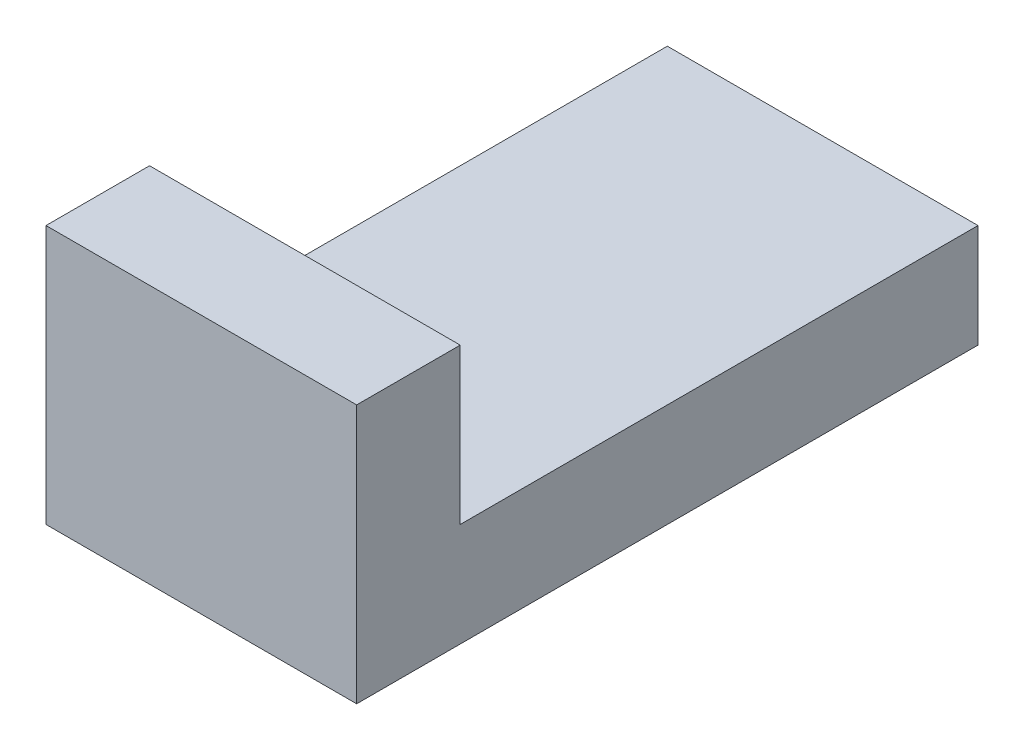
ISO-10303-21;
HEADER;
FILE_DESCRIPTION(('STEP AP214'),'2;1');
FILE_NAME('part.step','',(''),(''),'','','');
FILE_SCHEMA(('AUTOMOTIVE_DESIGN { 1 0 10303 214 1 1 1 1 }'));
ENDSEC;
DATA;
#1=APPLICATION_CONTEXT('core data for automotive mechanical design processes');
#2=APPLICATION_PROTOCOL_DEFINITION('international standard','automotive_design',2000,#1);
#3=PRODUCT_CONTEXT('',#1,'mechanical');
#4=PRODUCT('Part','Part','',(#3));
#5=PRODUCT_RELATED_PRODUCT_CATEGORY('part','',(#4));
#6=PRODUCT_DEFINITION_FORMATION('','',#4);
#7=PRODUCT_DEFINITION_CONTEXT('part definition',#1,'design');
#8=PRODUCT_DEFINITION('design','',#6,#7);
#9=PRODUCT_DEFINITION_SHAPE('','',#8);
#10=(LENGTH_UNIT() NAMED_UNIT(*) SI_UNIT(.MILLI.,.METRE.));
#11=(NAMED_UNIT(*) PLANE_ANGLE_UNIT() SI_UNIT($,.RADIAN.));
#12=(NAMED_UNIT(*) SI_UNIT($,.STERADIAN.) SOLID_ANGLE_UNIT());
#13=UNCERTAINTY_MEASURE_WITH_UNIT(LENGTH_MEASURE(1.E-05),#10,'distance_accuracy_value','');
#14=(GEOMETRIC_REPRESENTATION_CONTEXT(3) GLOBAL_UNCERTAINTY_ASSIGNED_CONTEXT((#13)) GLOBAL_UNIT_ASSIGNED_CONTEXT((#10,
#11,#12)) REPRESENTATION_CONTEXT('',''));
#15=CARTESIAN_POINT('',(0.,0.,0.));
#16=DIRECTION('',(0.,0.,1.));
#17=DIRECTION('',(1.,0.,0.));
#18=AXIS2_PLACEMENT_3D('',#15,#16,#17);
#19=CARTESIAN_POINT('',(15.,0.,0.));
#20=DIRECTION('',(0.,1.,0.));
#21=DIRECTION('',(0.,0.,1.));
#22=AXIS2_PLACEMENT_3D('',#19,#20,#21);
#23=PLANE('',#22);
#24=DIRECTION('',(0.,0.,-1.));
#25=VECTOR('',#24,1.);
#26=CARTESIAN_POINT('',(-15.,0.,0.));
#27=LINE('',#26,#25);
#28=CARTESIAN_POINT('',(-15.,0.,0.));
#29=VERTEX_POINT('',#28);
#30=CARTESIAN_POINT('',(-15.,0.,-60.));
#31=VERTEX_POINT('',#30);
#32=EDGE_CURVE('E120',#29,#31,#27,.T.);
#33=ORIENTED_EDGE('',*,*,#32,.T.);
#34=DIRECTION('',(-1.,0.,0.));
#35=VECTOR('',#34,1.);
#36=CARTESIAN_POINT('',(15.,0.,-60.));
#37=LINE('',#36,#35);
#38=CARTESIAN_POINT('',(15.,0.,-60.));
#39=VERTEX_POINT('',#38);
#40=EDGE_CURVE('E11',#39,#31,#37,.T.);
#41=ORIENTED_EDGE('',*,*,#40,.F.);
#42=DIRECTION('',(0.,0.,-1.));
#43=VECTOR('',#42,1.);
#44=CARTESIAN_POINT('',(15.,0.,0.));
#45=LINE('',#44,#43);
#46=CARTESIAN_POINT('',(15.,0.,0.));
#47=VERTEX_POINT('',#46);
#48=EDGE_CURVE('E82',#47,#39,#45,.T.);
#49=ORIENTED_EDGE('',*,*,#48,.F.);
#50=DIRECTION('',(-1.,0.,0.));
#51=VECTOR('',#50,1.);
#52=CARTESIAN_POINT('',(15.,0.,0.));
#53=LINE('',#52,#51);
#54=EDGE_CURVE('E116',#47,#29,#53,.T.);
#55=ORIENTED_EDGE('',*,*,#54,.T.);
#56=EDGE_LOOP('',(#33,#41,#49,#55));
#57=FACE_BOUND('',#56,.T.);
#58=ADVANCED_FACE('F39',(#57),#23,.F.);
#59=CARTESIAN_POINT('',(15.,10.,-60.));
#60=DIRECTION('',(0.,0.,-1.));
#61=DIRECTION('',(-1.,0.,0.));
#62=AXIS2_PLACEMENT_3D('',#59,#60,#61);
#63=PLANE('',#62);
#64=DIRECTION('',(0.,-1.,0.));
#65=VECTOR('',#64,1.);
#66=CARTESIAN_POINT('',(-15.,10.,-60.));
#67=LINE('',#66,#65);
#68=CARTESIAN_POINT('',(-15.,10.,-60.));
#69=VERTEX_POINT('',#68);
#70=EDGE_CURVE('E121',#69,#31,#67,.T.);
#71=ORIENTED_EDGE('',*,*,#70,.F.);
#72=DIRECTION('',(-1.,0.,0.));
#73=VECTOR('',#72,1.);
#74=CARTESIAN_POINT('',(15.,10.,-60.));
#75=LINE('',#74,#73);
#76=CARTESIAN_POINT('',(15.,10.,-60.));
#77=VERTEX_POINT('',#76);
#78=EDGE_CURVE('E50',#77,#69,#75,.T.);
#79=ORIENTED_EDGE('',*,*,#78,.F.);
#80=DIRECTION('',(0.,-1.,0.));
#81=VECTOR('',#80,1.);
#82=CARTESIAN_POINT('',(15.,10.,-60.));
#83=LINE('',#82,#81);
#84=EDGE_CURVE('E208',#77,#39,#83,.T.);
#85=ORIENTED_EDGE('',*,*,#84,.T.);
#86=ORIENTED_EDGE('',*,*,#40,.T.);
#87=EDGE_LOOP('',(#71,#79,#85,#86));
#88=FACE_BOUND('',#87,.T.);
#89=ADVANCED_FACE('F141',(#88),#63,.T.);
#90=CARTESIAN_POINT('',(15.,10.,0.));
#91=DIRECTION('',(0.,1.,0.));
#92=DIRECTION('',(0.,0.,1.));
#93=AXIS2_PLACEMENT_3D('',#90,#91,#92);
#94=PLANE('',#93);
#95=DIRECTION('',(0.,0.,-1.));
#96=VECTOR('',#95,1.);
#97=CARTESIAN_POINT('',(-15.,10.,0.));
#98=LINE('',#97,#96);
#99=CARTESIAN_POINT('',(-15.,10.,-10.));
#100=VERTEX_POINT('',#99);
#101=EDGE_CURVE('E128',#100,#69,#98,.T.);
#102=ORIENTED_EDGE('',*,*,#101,.F.);
#103=DIRECTION('',(-1.,0.,0.));
#104=VECTOR('',#103,1.);
#105=CARTESIAN_POINT('',(15.,10.,-10.));
#106=LINE('',#105,#104);
#107=CARTESIAN_POINT('',(15.,10.,-10.));
#108=VERTEX_POINT('',#107);
#109=EDGE_CURVE('E106',#108,#100,#106,.T.);
#110=ORIENTED_EDGE('',*,*,#109,.F.);
#111=DIRECTION('',(0.,0.,-1.));
#112=VECTOR('',#111,1.);
#113=CARTESIAN_POINT('',(15.,10.,0.));
#114=LINE('',#113,#112);
#115=EDGE_CURVE('E115',#108,#77,#114,.T.);
#116=ORIENTED_EDGE('',*,*,#115,.T.);
#117=ORIENTED_EDGE('',*,*,#78,.T.);
#118=EDGE_LOOP('',(#102,#110,#116,#117));
#119=FACE_BOUND('',#118,.T.);
#120=ADVANCED_FACE('F138',(#119),#94,.T.);
#121=CARTESIAN_POINT('',(15.,25.,-10.));
#122=DIRECTION('',(0.,0.,-1.));
#123=DIRECTION('',(0.,1.,0.));
#124=AXIS2_PLACEMENT_3D('',#121,#122,#123);
#125=PLANE('',#124);
#126=DIRECTION('',(0.,-1.,0.));
#127=VECTOR('',#126,1.);
#128=CARTESIAN_POINT('',(-15.,25.,-10.));
#129=LINE('',#128,#127);
#130=CARTESIAN_POINT('',(-15.,25.,-10.));
#131=VERTEX_POINT('',#130);
#132=EDGE_CURVE('E102',#131,#100,#129,.T.);
#133=ORIENTED_EDGE('',*,*,#132,.F.);
#134=DIRECTION('',(-1.,0.,0.));
#135=VECTOR('',#134,1.);
#136=CARTESIAN_POINT('',(15.,25.,-10.));
#137=LINE('',#136,#135);
#138=CARTESIAN_POINT('',(15.,25.,-10.));
#139=VERTEX_POINT('',#138);
#140=EDGE_CURVE('E96',#139,#131,#137,.T.);
#141=ORIENTED_EDGE('',*,*,#140,.F.);
#142=DIRECTION('',(0.,-1.,0.));
#143=VECTOR('',#142,1.);
#144=CARTESIAN_POINT('',(15.,25.,-10.));
#145=LINE('',#144,#143);
#146=EDGE_CURVE('E98',#139,#108,#145,.T.);
#147=ORIENTED_EDGE('',*,*,#146,.T.);
#148=ORIENTED_EDGE('',*,*,#109,.T.);
#149=EDGE_LOOP('',(#133,#141,#147,#148));
#150=FACE_BOUND('',#149,.T.);
#151=ADVANCED_FACE('F97',(#150),#125,.T.);
#152=CARTESIAN_POINT('',(15.,25.,0.));
#153=DIRECTION('',(0.,1.,0.));
#154=DIRECTION('',(0.,0.,1.));
#155=AXIS2_PLACEMENT_3D('',#152,#153,#154);
#156=PLANE('',#155);
#157=DIRECTION('',(0.,0.,-1.));
#158=VECTOR('',#157,1.);
#159=CARTESIAN_POINT('',(-15.,25.,0.));
#160=LINE('',#159,#158);
#161=CARTESIAN_POINT('',(-15.,25.,0.));
#162=VERTEX_POINT('',#161);
#163=EDGE_CURVE('E127',#162,#131,#160,.T.);
#164=ORIENTED_EDGE('',*,*,#163,.F.);
#165=DIRECTION('',(-1.,0.,0.));
#166=VECTOR('',#165,1.);
#167=CARTESIAN_POINT('',(15.,25.,0.));
#168=LINE('',#167,#166);
#169=CARTESIAN_POINT('',(15.,25.,0.));
#170=VERTEX_POINT('',#169);
#171=EDGE_CURVE('E78',#170,#162,#168,.T.);
#172=ORIENTED_EDGE('',*,*,#171,.F.);
#173=DIRECTION('',(0.,0.,-1.));
#174=VECTOR('',#173,1.);
#175=CARTESIAN_POINT('',(15.,25.,0.));
#176=LINE('',#175,#174);
#177=EDGE_CURVE('E110',#170,#139,#176,.T.);
#178=ORIENTED_EDGE('',*,*,#177,.T.);
#179=ORIENTED_EDGE('',*,*,#140,.T.);
#180=EDGE_LOOP('',(#164,#172,#178,#179));
#181=FACE_BOUND('',#180,.T.);
#182=ADVANCED_FACE('F114',(#181),#156,.T.);
#183=CARTESIAN_POINT('',(15.,25.,0.));
#184=DIRECTION('',(0.,0.,-1.));
#185=DIRECTION('',(0.,1.,0.));
#186=AXIS2_PLACEMENT_3D('',#183,#184,#185);
#187=PLANE('',#186);
#188=DIRECTION('',(0.,-1.,0.));
#189=VECTOR('',#188,1.);
#190=CARTESIAN_POINT('',(-15.,25.,0.));
#191=LINE('',#190,#189);
#192=EDGE_CURVE('E80',#162,#29,#191,.T.);
#193=ORIENTED_EDGE('',*,*,#192,.T.);
#194=ORIENTED_EDGE('',*,*,#54,.F.);
#195=DIRECTION('',(0.,-1.,0.));
#196=VECTOR('',#195,1.);
#197=CARTESIAN_POINT('',(15.,25.,0.));
#198=LINE('',#197,#196);
#199=EDGE_CURVE('E54',#170,#47,#198,.T.);
#200=ORIENTED_EDGE('',*,*,#199,.F.);
#201=ORIENTED_EDGE('',*,*,#171,.T.);
#202=EDGE_LOOP('',(#193,#194,#200,#201));
#203=FACE_BOUND('',#202,.T.);
#204=ADVANCED_FACE('F147',(#203),#187,.F.);
#205=CARTESIAN_POINT('',(15.,0.,0.));
#206=DIRECTION('',(-1.,0.,0.));
#207=DIRECTION('',(0.,0.,1.));
#208=AXIS2_PLACEMENT_3D('',#205,#206,#207);
#209=PLANE('',#208);
#210=ORIENTED_EDGE('',*,*,#48,.T.);
#211=ORIENTED_EDGE('',*,*,#84,.F.);
#212=ORIENTED_EDGE('',*,*,#115,.F.);
#213=ORIENTED_EDGE('',*,*,#146,.F.);
#214=ORIENTED_EDGE('',*,*,#177,.F.);
#215=ORIENTED_EDGE('',*,*,#199,.T.);
#216=EDGE_LOOP('',(#210,#211,#212,#213,#214,#215));
#217=FACE_BOUND('',#216,.T.);
#218=ADVANCED_FACE('F108',(#217),#209,.F.);
#219=CARTESIAN_POINT('',(-15.,0.,0.));
#220=DIRECTION('',(-1.,0.,0.));
#221=DIRECTION('',(0.,0.,1.));
#222=AXIS2_PLACEMENT_3D('',#219,#220,#221);
#223=PLANE('',#222);
#224=ORIENTED_EDGE('',*,*,#32,.F.);
#225=ORIENTED_EDGE('',*,*,#192,.F.);
#226=ORIENTED_EDGE('',*,*,#163,.T.);
#227=ORIENTED_EDGE('',*,*,#132,.T.);
#228=ORIENTED_EDGE('',*,*,#101,.T.);
#229=ORIENTED_EDGE('',*,*,#70,.T.);
#230=EDGE_LOOP('',(#224,#225,#226,#227,#228,#229));
#231=FACE_BOUND('',#230,.T.);
#232=ADVANCED_FACE('F143',(#231),#223,.T.);
#233=CLOSED_SHELL('',(#58,#89,#120,#151,#182,#204,#218,#232));
#234=MANIFOLD_SOLID_BREP('B2',#233);
#235=ADVANCED_BREP_SHAPE_REPRESENTATION('',(#18,#234),#14);
#236=SHAPE_DEFINITION_REPRESENTATION(#9,#235);
ENDSEC;
END-ISO-10303-21;
